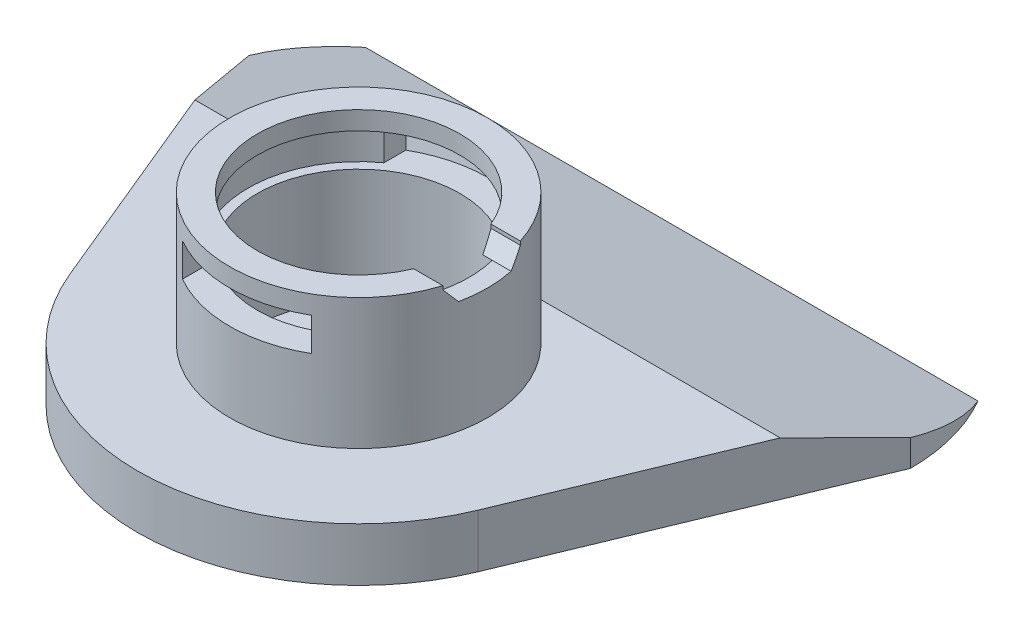
ISO-10303-21;
HEADER;
FILE_DESCRIPTION(('STEP AP214'),'2;1');
FILE_NAME('part.step','',(''),(''),'','','');
FILE_SCHEMA(('AUTOMOTIVE_DESIGN { 1 0 10303 214 1 1 1 1 }'));
ENDSEC;
DATA;
#1=APPLICATION_CONTEXT('core data for automotive mechanical design processes');
#2=APPLICATION_PROTOCOL_DEFINITION('international standard','automotive_design',2000,#1);
#3=PRODUCT_CONTEXT('',#1,'mechanical');
#4=PRODUCT('Part','Part','',(#3));
#5=PRODUCT_RELATED_PRODUCT_CATEGORY('part','',(#4));
#6=PRODUCT_DEFINITION_FORMATION('','',#4);
#7=PRODUCT_DEFINITION_CONTEXT('part definition',#1,'design');
#8=PRODUCT_DEFINITION('design','',#6,#7);
#9=PRODUCT_DEFINITION_SHAPE('','',#8);
#10=(LENGTH_UNIT() NAMED_UNIT(*) SI_UNIT(.MILLI.,.METRE.));
#11=(NAMED_UNIT(*) PLANE_ANGLE_UNIT() SI_UNIT($,.RADIAN.));
#12=(NAMED_UNIT(*) SI_UNIT($,.STERADIAN.) SOLID_ANGLE_UNIT());
#13=UNCERTAINTY_MEASURE_WITH_UNIT(LENGTH_MEASURE(1.E-05),#10,'distance_accuracy_value','');
#14=(GEOMETRIC_REPRESENTATION_CONTEXT(3) GLOBAL_UNCERTAINTY_ASSIGNED_CONTEXT((#13)) GLOBAL_UNIT_ASSIGNED_CONTEXT((#10,
#11,#12)) REPRESENTATION_CONTEXT('',''));
#15=CARTESIAN_POINT('',(0.,0.,0.));
#16=DIRECTION('',(0.,0.,1.));
#17=DIRECTION('',(1.,0.,0.));
#18=AXIS2_PLACEMENT_3D('',#15,#16,#17);
#19=CARTESIAN_POINT('',(0.,10.,0.));
#20=DIRECTION('',(0.,-1.,0.));
#21=DIRECTION('',(0.,0.,-1.));
#22=AXIS2_PLACEMENT_3D('',#19,#20,#21);
#23=CYLINDRICAL_SURFACE('',#22,7.);
#24=DIRECTION('',(0.,-1.,0.));
#25=VECTOR('',#24,1.);
#26=CARTESIAN_POINT('',(3.5,10.,6.06217782649107));
#27=LINE('',#26,#25);
#28=CARTESIAN_POINT('',(3.5,7.2,6.06217782649107));
#29=VERTEX_POINT('',#28);
#30=CARTESIAN_POINT('',(3.5,9.,6.06217782649107));
#31=VERTEX_POINT('',#30);
#32=EDGE_CURVE('E307',#29,#31,#27,.F.);
#33=ORIENTED_EDGE('',*,*,#32,.F.);
#34=CARTESIAN_POINT('',(0.,7.2,0.));
#35=DIRECTION('',(0.,1.,0.));
#36=DIRECTION('',(0.,0.,1.));
#37=AXIS2_PLACEMENT_3D('',#34,#35,#36);
#38=CIRCLE('',#37,7.);
#39=CARTESIAN_POINT('',(-3.5,7.2,6.06217782649107));
#40=VERTEX_POINT('',#39);
#41=EDGE_CURVE('E280',#40,#29,#38,.T.);
#42=ORIENTED_EDGE('',*,*,#41,.F.);
#43=DIRECTION('',(0.,-1.,0.));
#44=VECTOR('',#43,1.);
#45=CARTESIAN_POINT('',(-3.5,10.,6.06217782649107));
#46=LINE('',#45,#44);
#47=CARTESIAN_POINT('',(-3.5,9.,6.06217782649107));
#48=VERTEX_POINT('',#47);
#49=EDGE_CURVE('E292',#40,#48,#46,.F.);
#50=ORIENTED_EDGE('',*,*,#49,.T.);
#51=CARTESIAN_POINT('',(0.,9.,0.));
#52=DIRECTION('',(0.,-1.,0.));
#53=DIRECTION('',(0.,0.,-1.));
#54=AXIS2_PLACEMENT_3D('',#51,#52,#53);
#55=CIRCLE('',#54,7.);
#56=EDGE_CURVE('E316',#31,#48,#55,.T.);
#57=ORIENTED_EDGE('',*,*,#56,.F.);
#58=EDGE_LOOP('',(#33,#42,#50,#57));
#59=FACE_BOUND('',#58,.T.);
#60=CARTESIAN_POINT('',(0.,2.9,0.));
#61=DIRECTION('',(0.,1.,0.));
#62=DIRECTION('',(0.,0.,1.));
#63=AXIS2_PLACEMENT_3D('',#60,#61,#62);
#64=CIRCLE('',#63,7.);
#65=CARTESIAN_POINT('',(0.,2.9,-7.));
#66=VERTEX_POINT('',#65);
#67=EDGE_CURVE('E347',#66,#66,#64,.F.);
#68=ORIENTED_EDGE('',*,*,#67,.F.);
#69=EDGE_LOOP('',(#68));
#70=FACE_BOUND('',#69,.T.);
#71=DIRECTION('',(0.,-1.,0.));
#72=VECTOR('',#71,1.);
#73=CARTESIAN_POINT('',(3.5,10.,-6.06217782649107));
#74=LINE('',#73,#72);
#75=CARTESIAN_POINT('',(3.5,9.,-6.06217782649107));
#76=VERTEX_POINT('',#75);
#77=CARTESIAN_POINT('',(3.5,7.2,-6.06217782649107));
#78=VERTEX_POINT('',#77);
#79=EDGE_CURVE('E310',#76,#78,#74,.T.);
#80=ORIENTED_EDGE('',*,*,#79,.F.);
#81=CARTESIAN_POINT('',(-3.5,9.,-6.06217782649107));
#82=VERTEX_POINT('',#81);
#83=EDGE_CURVE('E313',#82,#76,#55,.T.);
#84=ORIENTED_EDGE('',*,*,#83,.F.);
#85=DIRECTION('',(0.,-1.,0.));
#86=VECTOR('',#85,1.);
#87=CARTESIAN_POINT('',(-3.5,10.,-6.06217782649107));
#88=LINE('',#87,#86);
#89=CARTESIAN_POINT('',(-3.5,7.2,-6.06217782649107));
#90=VERTEX_POINT('',#89);
#91=EDGE_CURVE('E296',#82,#90,#88,.T.);
#92=ORIENTED_EDGE('',*,*,#91,.T.);
#93=EDGE_CURVE('E283',#78,#90,#38,.T.);
#94=ORIENTED_EDGE('',*,*,#93,.F.);
#95=EDGE_LOOP('',(#80,#84,#92,#94));
#96=FACE_BOUND('',#95,.T.);
#97=DIRECTION('',(0.,-1.,0.));
#98=VECTOR('',#97,1.);
#99=CARTESIAN_POINT('',(6.67757440991862,10.,-2.1));
#100=LINE('',#99,#98);
#101=CARTESIAN_POINT('',(6.67757440991862,9.8,-2.1));
#102=VERTEX_POINT('',#101);
#103=CARTESIAN_POINT('',(6.67757440991862,10.,-2.1));
#104=VERTEX_POINT('',#103);
#105=EDGE_CURVE('E216',#102,#104,#100,.F.);
#106=ORIENTED_EDGE('',*,*,#105,.F.);
#107=CARTESIAN_POINT('',(0.,7.29731745555217,0.));
#108=DIRECTION('',(0.,0.642787609686541,0.766044443118977));
#109=DIRECTION('',(0.,-0.766044443118977,0.642787609686541));
#110=AXIS2_PLACEMENT_3D('',#107,#108,#109);
#111=ELLIPSE('',#110,10.8900667880229,7.);
#112=CARTESIAN_POINT('',(6.85264608151398,9.,-1.42872029505817));
#113=VERTEX_POINT('',#112);
#114=EDGE_CURVE('E202',#113,#102,#111,.T.);
#115=ORIENTED_EDGE('',*,*,#114,.F.);
#116=CARTESIAN_POINT('',(0.,9.,0.));
#117=DIRECTION('',(0.,1.,0.));
#118=DIRECTION('',(0.,0.,1.));
#119=AXIS2_PLACEMENT_3D('',#116,#117,#118);
#120=CIRCLE('',#119,7.);
#121=CARTESIAN_POINT('',(6.85264608151398,9.,1.42872029505817));
#122=VERTEX_POINT('',#121);
#123=EDGE_CURVE('E227',#122,#113,#120,.T.);
#124=ORIENTED_EDGE('',*,*,#123,.F.);
#125=CARTESIAN_POINT('',(0.,7.29731745555217,0.));
#126=DIRECTION('',(0.,0.642787609686541,-0.766044443118977));
#127=DIRECTION('',(0.,-0.766044443118977,-0.642787609686541));
#128=AXIS2_PLACEMENT_3D('',#125,#126,#127);
#129=ELLIPSE('',#128,10.8900667880229,7.);
#130=CARTESIAN_POINT('',(6.67757440991862,9.8,2.1));
#131=VERTEX_POINT('',#130);
#132=EDGE_CURVE('E433',#131,#122,#129,.T.);
#133=ORIENTED_EDGE('',*,*,#132,.F.);
#134=DIRECTION('',(0.,-1.,0.));
#135=VECTOR('',#134,1.);
#136=CARTESIAN_POINT('',(6.67757440991862,10.,2.1));
#137=LINE('',#136,#135);
#138=CARTESIAN_POINT('',(6.67757440991862,10.,2.1));
#139=VERTEX_POINT('',#138);
#140=EDGE_CURVE('E234',#139,#131,#137,.T.);
#141=ORIENTED_EDGE('',*,*,#140,.F.);
#142=CARTESIAN_POINT('',(0.,10.,0.));
#143=DIRECTION('',(0.,1.,0.));
#144=DIRECTION('',(0.,0.,1.));
#145=AXIS2_PLACEMENT_3D('',#142,#143,#144);
#146=CIRCLE('',#145,7.);
#147=EDGE_CURVE('E225',#104,#139,#146,.T.);
#148=ORIENTED_EDGE('',*,*,#147,.F.);
#149=EDGE_LOOP('',(#106,#115,#124,#133,#141,#148));
#150=FACE_BOUND('',#149,.T.);
#151=ADVANCED_FACE('F44',(#59,#70,#96,#150),#23,.T.);
#152=CARTESIAN_POINT('',(0.,10.,0.));
#153=DIRECTION('',(0.,1.,0.));
#154=DIRECTION('',(0.,0.,1.));
#155=AXIS2_PLACEMENT_3D('',#152,#153,#154);
#156=PLANE('',#155);
#157=CARTESIAN_POINT('',(0.,10.,0.));
#158=DIRECTION('',(0.,1.,0.));
#159=DIRECTION('',(0.,0.,1.));
#160=AXIS2_PLACEMENT_3D('',#157,#158,#159);
#161=CIRCLE('',#160,5.5);
#162=CARTESIAN_POINT('',(5.08330601085553,10.,-2.1));
#163=VERTEX_POINT('',#162);
#164=CARTESIAN_POINT('',(5.08330601085553,10.,2.1));
#165=VERTEX_POINT('',#164);
#166=EDGE_CURVE('E330',#163,#165,#161,.T.);
#167=ORIENTED_EDGE('',*,*,#166,.F.);
#168=DIRECTION('',(1.,0.,0.));
#169=VECTOR('',#168,1.);
#170=CARTESIAN_POINT('',(0.,10.,-2.1));
#171=LINE('',#170,#169);
#172=EDGE_CURVE('E228',#163,#104,#171,.T.);
#173=ORIENTED_EDGE('',*,*,#172,.T.);
#174=ORIENTED_EDGE('',*,*,#147,.T.);
#175=DIRECTION('',(-1.,0.,0.));
#176=VECTOR('',#175,1.);
#177=CARTESIAN_POINT('',(0.,10.,2.1));
#178=LINE('',#177,#176);
#179=EDGE_CURVE('E425',#139,#165,#178,.T.);
#180=ORIENTED_EDGE('',*,*,#179,.T.);
#181=EDGE_LOOP('',(#167,#173,#174,#180));
#182=FACE_BOUND('',#181,.T.);
#183=ADVANCED_FACE('F431',(#182),#156,.T.);
#184=CARTESIAN_POINT('',(0.,1.,0.));
#185=DIRECTION('',(0.,1.,0.));
#186=DIRECTION('',(0.,0.,1.));
#187=AXIS2_PLACEMENT_3D('',#184,#185,#186);
#188=CYLINDRICAL_SURFACE('',#187,5.5);
#189=CARTESIAN_POINT('',(0.,7.29731745555217,0.));
#190=DIRECTION('',(0.,0.642787609686541,0.766044443118977));
#191=DIRECTION('',(0.,0.766044443118977,-0.642787609686541));
#192=AXIS2_PLACEMENT_3D('',#189,#190,#191);
#193=ELLIPSE('',#192,8.55648104773225,5.5);
#194=CARTESIAN_POINT('',(5.08330601085553,9.8,-2.1));
#195=VERTEX_POINT('',#194);
#196=CARTESIAN_POINT('',(5.31119179831503,9.,-1.42872029505817));
#197=VERTEX_POINT('',#196);
#198=EDGE_CURVE('E60',#195,#197,#193,.F.);
#199=ORIENTED_EDGE('',*,*,#198,.F.);
#200=DIRECTION('',(0.,1.,0.));
#201=VECTOR('',#200,1.);
#202=CARTESIAN_POINT('',(5.08330601085553,1.,-2.1));
#203=LINE('',#202,#201);
#204=EDGE_CURVE('E11',#163,#195,#203,.F.);
#205=ORIENTED_EDGE('',*,*,#204,.F.);
#206=ORIENTED_EDGE('',*,*,#166,.T.);
#207=DIRECTION('',(0.,1.,0.));
#208=VECTOR('',#207,1.);
#209=CARTESIAN_POINT('',(5.08330601085553,1.,2.1));
#210=LINE('',#209,#208);
#211=CARTESIAN_POINT('',(5.08330601085553,9.8,2.1));
#212=VERTEX_POINT('',#211);
#213=EDGE_CURVE('E53',#212,#165,#210,.T.);
#214=ORIENTED_EDGE('',*,*,#213,.F.);
#215=CARTESIAN_POINT('',(0.,7.29731745555217,0.));
#216=DIRECTION('',(0.,0.642787609686541,-0.766044443118977));
#217=DIRECTION('',(0.,0.766044443118977,0.642787609686541));
#218=AXIS2_PLACEMENT_3D('',#215,#216,#217);
#219=ELLIPSE('',#218,8.55648104773225,5.5);
#220=CARTESIAN_POINT('',(5.31119179831503,9.,1.42872029505817));
#221=VERTEX_POINT('',#220);
#222=EDGE_CURVE('E212',#221,#212,#219,.F.);
#223=ORIENTED_EDGE('',*,*,#222,.F.);
#224=CARTESIAN_POINT('',(0.,9.,0.));
#225=DIRECTION('',(0.,1.,0.));
#226=DIRECTION('',(0.,0.,1.));
#227=AXIS2_PLACEMENT_3D('',#224,#225,#226);
#228=CIRCLE('',#227,5.5);
#229=EDGE_CURVE('E322',#197,#221,#228,.T.);
#230=ORIENTED_EDGE('',*,*,#229,.F.);
#231=EDGE_LOOP('',(#199,#205,#206,#214,#223,#230));
#232=FACE_BOUND('',#231,.T.);
#233=ADVANCED_FACE('F435',(#232),#188,.F.);
#234=CARTESIAN_POINT('',(0.,9.,0.));
#235=DIRECTION('',(0.,1.,0.));
#236=DIRECTION('',(0.,0.,1.));
#237=AXIS2_PLACEMENT_3D('',#234,#235,#236);
#238=PLANE('',#237);
#239=DIRECTION('',(-1.,0.,0.));
#240=VECTOR('',#239,1.);
#241=CARTESIAN_POINT('',(0.,9.,1.42872029505817));
#242=LINE('',#241,#240);
#243=CARTESIAN_POINT('',(5.82741437676169,9.,1.42872029505817));
#244=VERTEX_POINT('',#243);
#245=EDGE_CURVE('E417',#244,#221,#242,.T.);
#246=ORIENTED_EDGE('',*,*,#245,.F.);
#247=CARTESIAN_POINT('',(0.,9.,0.));
#248=DIRECTION('',(0.,1.,0.));
#249=DIRECTION('',(0.,0.,1.));
#250=AXIS2_PLACEMENT_3D('',#247,#248,#249);
#251=CIRCLE('',#250,6.);
#252=CARTESIAN_POINT('',(3.5,9.,4.87339717240448));
#253=VERTEX_POINT('',#252);
#254=EDGE_CURVE('E332',#253,#244,#251,.T.);
#255=ORIENTED_EDGE('',*,*,#254,.F.);
#256=DIRECTION('',(0.,0.,1.));
#257=VECTOR('',#256,1.);
#258=CARTESIAN_POINT('',(3.5,9.,-17.));
#259=LINE('',#258,#257);
#260=EDGE_CURVE('E68',#253,#31,#259,.T.);
#261=ORIENTED_EDGE('',*,*,#260,.T.);
#262=ORIENTED_EDGE('',*,*,#56,.T.);
#263=DIRECTION('',(0.,0.,1.));
#264=VECTOR('',#263,1.);
#265=CARTESIAN_POINT('',(-3.5,9.,-17.));
#266=LINE('',#265,#264);
#267=CARTESIAN_POINT('',(-3.5,9.,4.87339717240448));
#268=VERTEX_POINT('',#267);
#269=EDGE_CURVE('E273',#268,#48,#266,.T.);
#270=ORIENTED_EDGE('',*,*,#269,.F.);
#271=CARTESIAN_POINT('',(-3.5,9.,-4.87339717240448));
#272=VERTEX_POINT('',#271);
#273=EDGE_CURVE('E321',#272,#268,#251,.T.);
#274=ORIENTED_EDGE('',*,*,#273,.F.);
#275=EDGE_CURVE('E272',#82,#272,#266,.T.);
#276=ORIENTED_EDGE('',*,*,#275,.F.);
#277=ORIENTED_EDGE('',*,*,#83,.T.);
#278=CARTESIAN_POINT('',(3.5,9.,-4.87339717240448));
#279=VERTEX_POINT('',#278);
#280=EDGE_CURVE('E277',#76,#279,#259,.T.);
#281=ORIENTED_EDGE('',*,*,#280,.T.);
#282=CARTESIAN_POINT('',(5.82741437676169,9.,-1.42872029505817));
#283=VERTEX_POINT('',#282);
#284=EDGE_CURVE('E337',#283,#279,#251,.T.);
#285=ORIENTED_EDGE('',*,*,#284,.F.);
#286=DIRECTION('',(1.,0.,0.));
#287=VECTOR('',#286,1.);
#288=CARTESIAN_POINT('',(0.,9.,-1.42872029505817));
#289=LINE('',#288,#287);
#290=EDGE_CURVE('E414',#197,#283,#289,.T.);
#291=ORIENTED_EDGE('',*,*,#290,.F.);
#292=ORIENTED_EDGE('',*,*,#229,.T.);
#293=EDGE_LOOP('',(#246,#255,#261,#262,#270,#274,#276,#277,#281,#285,#291,#292));
#294=FACE_BOUND('',#293,.T.);
#295=ADVANCED_FACE('F460',(#294),#238,.F.);
#296=CARTESIAN_POINT('',(0.,7.2,0.));
#297=DIRECTION('',(0.,1.,0.));
#298=DIRECTION('',(0.,0.,1.));
#299=AXIS2_PLACEMENT_3D('',#296,#297,#298);
#300=CYLINDRICAL_SURFACE('',#299,6.);
#301=DIRECTION('',(0.,1.,0.));
#302=VECTOR('',#301,1.);
#303=CARTESIAN_POINT('',(3.5,7.2,4.87339717240448));
#304=LINE('',#303,#302);
#305=CARTESIAN_POINT('',(3.5,7.2,4.87339717240448));
#306=VERTEX_POINT('',#305);
#307=EDGE_CURVE('E304',#253,#306,#304,.F.);
#308=ORIENTED_EDGE('',*,*,#307,.F.);
#309=ORIENTED_EDGE('',*,*,#254,.T.);
#310=EDGE_CURVE('E336',#244,#283,#251,.T.);
#311=ORIENTED_EDGE('',*,*,#310,.T.);
#312=ORIENTED_EDGE('',*,*,#284,.T.);
#313=DIRECTION('',(0.,1.,0.));
#314=VECTOR('',#313,1.);
#315=CARTESIAN_POINT('',(3.5,7.2,-4.87339717240448));
#316=LINE('',#315,#314);
#317=CARTESIAN_POINT('',(3.5,7.2,-4.87339717240448));
#318=VERTEX_POINT('',#317);
#319=EDGE_CURVE('E300',#318,#279,#316,.T.);
#320=ORIENTED_EDGE('',*,*,#319,.F.);
#321=CARTESIAN_POINT('',(0.,7.2,0.));
#322=DIRECTION('',(0.,1.,0.));
#323=DIRECTION('',(0.,0.,1.));
#324=AXIS2_PLACEMENT_3D('',#321,#322,#323);
#325=CIRCLE('',#324,6.);
#326=EDGE_CURVE('E326',#306,#318,#325,.T.);
#327=ORIENTED_EDGE('',*,*,#326,.F.);
#328=EDGE_LOOP('',(#308,#309,#311,#312,#320,#327));
#329=FACE_BOUND('',#328,.T.);
#330=ADVANCED_FACE('F463',(#329),#300,.F.);
#331=CARTESIAN_POINT('',(0.,2.9,0.));
#332=DIRECTION('',(0.,-1.,0.));
#333=DIRECTION('',(0.,0.,-1.));
#334=AXIS2_PLACEMENT_3D('',#331,#332,#333);
#335=CYLINDRICAL_SURFACE('',#334,12.);
#336=CARTESIAN_POINT('',(0.,0.,0.));
#337=DIRECTION('',(0.,1.,0.));
#338=DIRECTION('',(0.,0.,1.));
#339=AXIS2_PLACEMENT_3D('',#336,#337,#338);
#340=CIRCLE('',#339,12.);
#341=CARTESIAN_POINT('',(-11.0865543901354,0.,4.59220118838109));
#342=VERTEX_POINT('',#341);
#343=CARTESIAN_POINT('',(11.0865543901354,0.,4.59220118838109));
#344=VERTEX_POINT('',#343);
#345=EDGE_CURVE('E351',#342,#344,#340,.T.);
#346=ORIENTED_EDGE('',*,*,#345,.T.);
#347=DIRECTION('',(0.,-1.,0.));
#348=VECTOR('',#347,1.);
#349=CARTESIAN_POINT('',(11.0865543901354,2.9,4.59220118838109));
#350=LINE('',#349,#348);
#351=CARTESIAN_POINT('',(11.0865543901354,2.9,4.59220118838109));
#352=VERTEX_POINT('',#351);
#353=EDGE_CURVE('E410',#352,#344,#350,.T.);
#354=ORIENTED_EDGE('',*,*,#353,.F.);
#355=CARTESIAN_POINT('',(0.,2.9,0.));
#356=DIRECTION('',(0.,1.,0.));
#357=DIRECTION('',(0.,0.,1.));
#358=AXIS2_PLACEMENT_3D('',#355,#356,#357);
#359=CIRCLE('',#358,12.);
#360=CARTESIAN_POINT('',(-11.0865543901354,2.9,4.59220118838109));
#361=VERTEX_POINT('',#360);
#362=EDGE_CURVE('E352',#361,#352,#359,.T.);
#363=ORIENTED_EDGE('',*,*,#362,.F.);
#364=DIRECTION('',(0.,-1.,0.));
#365=VECTOR('',#364,1.);
#366=CARTESIAN_POINT('',(-11.0865543901354,2.9,4.59220118838109));
#367=LINE('',#366,#365);
#368=EDGE_CURVE('E365',#361,#342,#367,.T.);
#369=ORIENTED_EDGE('',*,*,#368,.T.);
#370=EDGE_LOOP('',(#346,#354,#363,#369));
#371=FACE_BOUND('',#370,.T.);
#372=ADVANCED_FACE('F46',(#371),#335,.T.);
#373=CARTESIAN_POINT('',(11.0865543901354,2.9,4.59220118838109));
#374=DIRECTION('',(-0.923879532511286,0.,-0.382683432365091));
#375=DIRECTION('',(-0.382683432365091,0.,0.923879532511287));
#376=AXIS2_PLACEMENT_3D('',#373,#374,#375);
#377=PLANE('',#376);
#378=DIRECTION('',(0.,-1.,0.));
#379=VECTOR('',#378,1.);
#380=CARTESIAN_POINT('',(17.9592691519859,2.9,-12.));
#381=LINE('',#380,#379);
#382=CARTESIAN_POINT('',(17.9592691519859,1.45,-12.));
#383=VERTEX_POINT('',#382);
#384=CARTESIAN_POINT('',(17.9592691519859,0.,-12.));
#385=VERTEX_POINT('',#384);
#386=EDGE_CURVE('E407',#383,#385,#381,.T.);
#387=ORIENTED_EDGE('',*,*,#386,.F.);
#388=DIRECTION('',(-0.3696460402259,0.258797300241354,0.892404483590876));
#389=VECTOR('',#388,1.);
#390=CARTESIAN_POINT('',(11.4081497008664,6.03658241400943,3.81580142761872));
#391=LINE('',#390,#389);
#392=CARTESIAN_POINT('',(15.8882013401204,2.9,-7.));
#393=VERTEX_POINT('',#392);
#394=EDGE_CURVE('E258',#383,#393,#391,.T.);
#395=ORIENTED_EDGE('',*,*,#394,.T.);
#396=DIRECTION('',(0.382683432365091,0.,-0.923879532511287));
#397=VECTOR('',#396,1.);
#398=CARTESIAN_POINT('',(11.0865543901354,2.9,4.59220118838109));
#399=LINE('',#398,#397);
#400=EDGE_CURVE('E356',#352,#393,#399,.T.);
#401=ORIENTED_EDGE('',*,*,#400,.F.);
#402=ORIENTED_EDGE('',*,*,#353,.T.);
#403=DIRECTION('',(0.382683432365091,0.,-0.923879532511287));
#404=VECTOR('',#403,1.);
#405=CARTESIAN_POINT('',(11.0865543901354,0.,4.59220118838109));
#406=LINE('',#405,#404);
#407=EDGE_CURVE('E369',#344,#385,#406,.T.);
#408=ORIENTED_EDGE('',*,*,#407,.T.);
#409=EDGE_LOOP('',(#387,#395,#401,#402,#408));
#410=FACE_BOUND('',#409,.T.);
#411=ADVANCED_FACE('F500',(#410),#377,.F.);
#412=CARTESIAN_POINT('',(17.9592691519859,2.9,0.));
#413=DIRECTION('',(-1.,0.,0.));
#414=DIRECTION('',(0.,0.,1.));
#415=AXIS2_PLACEMENT_3D('',#412,#413,#414);
#416=PLANE('',#415);
#417=DIRECTION('',(0.,-1.,0.));
#418=VECTOR('',#417,1.);
#419=CARTESIAN_POINT('',(17.9592691519859,2.9,-12.01));
#420=LINE('',#419,#418);
#421=CARTESIAN_POINT('',(17.9592691519859,1.4471,-12.01));
#422=VERTEX_POINT('',#421);
#423=CARTESIAN_POINT('',(17.9592691519859,0.,-12.01));
#424=VERTEX_POINT('',#423);
#425=EDGE_CURVE('E404',#422,#424,#420,.T.);
#426=ORIENTED_EDGE('',*,*,#425,.F.);
#427=DIRECTION('',(0.,-0.278524450245832,-0.960429138778732));
#428=VECTOR('',#427,1.);
#429=CARTESIAN_POINT('',(17.9592691519859,0.,-17.));
#430=LINE('',#429,#428);
#431=EDGE_CURVE('E232',#383,#422,#430,.T.);
#432=ORIENTED_EDGE('',*,*,#431,.F.);
#433=ORIENTED_EDGE('',*,*,#386,.T.);
#434=DIRECTION('',(0.,0.,-1.));
#435=VECTOR('',#434,1.);
#436=CARTESIAN_POINT('',(17.9592691519859,0.,0.));
#437=LINE('',#436,#435);
#438=EDGE_CURVE('E373',#385,#424,#437,.T.);
#439=ORIENTED_EDGE('',*,*,#438,.T.);
#440=EDGE_LOOP('',(#426,#432,#433,#439));
#441=FACE_BOUND('',#440,.T.);
#442=ADVANCED_FACE('F504',(#441),#416,.F.);
#443=CARTESIAN_POINT('',(7.96926915198588,2.9,-12.01));
#444=DIRECTION('',(0.,-1.,0.));
#445=DIRECTION('',(0.,0.,-1.));
#446=AXIS2_PLACEMENT_3D('',#443,#444,#445);
#447=CYLINDRICAL_SURFACE('',#446,9.99);
#448=CARTESIAN_POINT('',(7.96926915198588,0.,-12.01));
#449=DIRECTION('',(0.,1.,0.));
#450=DIRECTION('',(0.,0.,1.));
#451=AXIS2_PLACEMENT_3D('',#448,#449,#450);
#452=CIRCLE('',#451,9.99);
#453=CARTESIAN_POINT('',(16.6237477613534,0.,-17.));
#454=VERTEX_POINT('',#453);
#455=EDGE_CURVE('E377',#424,#454,#452,.T.);
#456=ORIENTED_EDGE('',*,*,#455,.T.);
#457=CARTESIAN_POINT('',(7.96926915198588,1.4471,-12.01));
#458=DIRECTION('',(0.,-0.960429138778732,0.278524450245832));
#459=DIRECTION('',(0.,-0.278524450245832,-0.960429138778732));
#460=AXIS2_PLACEMENT_3D('',#457,#458,#459);
#461=ELLIPSE('',#460,10.4016002812067,9.99);
#462=EDGE_CURVE('E254',#454,#422,#461,.T.);
#463=ORIENTED_EDGE('',*,*,#462,.T.);
#464=ORIENTED_EDGE('',*,*,#425,.T.);
#465=EDGE_LOOP('',(#456,#463,#464));
#466=FACE_BOUND('',#465,.T.);
#467=ADVANCED_FACE('F508',(#466),#447,.T.);
#468=CARTESIAN_POINT('',(-7.96926915198588,2.9,-12.01));
#469=DIRECTION('',(0.,-1.,0.));
#470=DIRECTION('',(0.,0.,-1.));
#471=AXIS2_PLACEMENT_3D('',#468,#469,#470);
#472=CYLINDRICAL_SURFACE('',#471,9.99);
#473=CARTESIAN_POINT('',(-7.96926915198588,1.4471,-12.01));
#474=DIRECTION('',(0.,-0.960429138778732,0.278524450245832));
#475=DIRECTION('',(0.,-0.278524450245832,-0.960429138778732));
#476=AXIS2_PLACEMENT_3D('',#473,#474,#475);
#477=ELLIPSE('',#476,10.4016002812067,9.99);
#478=CARTESIAN_POINT('',(-16.6237477613534,0.,-17.));
#479=VERTEX_POINT('',#478);
#480=CARTESIAN_POINT('',(-17.9592691519859,1.4471,-12.01));
#481=VERTEX_POINT('',#480);
#482=EDGE_CURVE('E251',#479,#481,#477,.F.);
#483=ORIENTED_EDGE('',*,*,#482,.F.);
#484=CARTESIAN_POINT('',(-7.96926915198588,0.,-12.01));
#485=DIRECTION('',(0.,1.,0.));
#486=DIRECTION('',(0.,0.,1.));
#487=AXIS2_PLACEMENT_3D('',#484,#485,#486);
#488=CIRCLE('',#487,9.99);
#489=CARTESIAN_POINT('',(-17.9592691519859,0.,-12.01));
#490=VERTEX_POINT('',#489);
#491=EDGE_CURVE('E385',#490,#479,#488,.F.);
#492=ORIENTED_EDGE('',*,*,#491,.F.);
#493=DIRECTION('',(0.,-1.,0.));
#494=VECTOR('',#493,1.);
#495=CARTESIAN_POINT('',(-17.9592691519859,2.9,-12.01));
#496=LINE('',#495,#494);
#497=EDGE_CURVE('E401',#481,#490,#496,.T.);
#498=ORIENTED_EDGE('',*,*,#497,.F.);
#499=EDGE_LOOP('',(#483,#492,#498));
#500=FACE_BOUND('',#499,.T.);
#501=ADVANCED_FACE('F514',(#500),#472,.T.);
#502=CARTESIAN_POINT('',(-17.9592691519859,2.9,0.));
#503=DIRECTION('',(-1.,0.,0.));
#504=DIRECTION('',(0.,0.,1.));
#505=AXIS2_PLACEMENT_3D('',#502,#503,#504);
#506=PLANE('',#505);
#507=DIRECTION('',(0.,-0.278524450245832,-0.960429138778732));
#508=VECTOR('',#507,1.);
#509=CARTESIAN_POINT('',(-17.9592691519859,0.,-17.));
#510=LINE('',#509,#508);
#511=CARTESIAN_POINT('',(-17.9592691519859,1.45,-12.));
#512=VERTEX_POINT('',#511);
#513=EDGE_CURVE('E240',#512,#481,#510,.T.);
#514=ORIENTED_EDGE('',*,*,#513,.T.);
#515=ORIENTED_EDGE('',*,*,#497,.T.);
#516=DIRECTION('',(0.,0.,-1.));
#517=VECTOR('',#516,1.);
#518=CARTESIAN_POINT('',(-17.9592691519859,0.,0.));
#519=LINE('',#518,#517);
#520=CARTESIAN_POINT('',(-17.9592691519859,0.,-12.));
#521=VERTEX_POINT('',#520);
#522=EDGE_CURVE('E389',#521,#490,#519,.T.);
#523=ORIENTED_EDGE('',*,*,#522,.F.);
#524=DIRECTION('',(0.,-1.,0.));
#525=VECTOR('',#524,1.);
#526=CARTESIAN_POINT('',(-17.9592691519859,2.9,-12.));
#527=LINE('',#526,#525);
#528=EDGE_CURVE('E398',#512,#521,#527,.T.);
#529=ORIENTED_EDGE('',*,*,#528,.F.);
#530=EDGE_LOOP('',(#514,#515,#523,#529));
#531=FACE_BOUND('',#530,.T.);
#532=ADVANCED_FACE('F521',(#531),#506,.T.);
#533=CARTESIAN_POINT('',(-11.0865543901354,2.9,4.59220118838109));
#534=DIRECTION('',(-0.923879532511287,0.,0.382683432365091));
#535=DIRECTION('',(0.382683432365091,0.,0.923879532511287));
#536=AXIS2_PLACEMENT_3D('',#533,#534,#535);
#537=PLANE('',#536);
#538=DIRECTION('',(0.3696460402259,0.258797300241354,0.892404483590876));
#539=VECTOR('',#538,1.);
#540=CARTESIAN_POINT('',(-11.4081497008664,6.03658241400943,3.81580142761872));
#541=LINE('',#540,#539);
#542=CARTESIAN_POINT('',(-15.8882013401204,2.9,-7.));
#543=VERTEX_POINT('',#542);
#544=EDGE_CURVE('E248',#512,#543,#541,.T.);
#545=ORIENTED_EDGE('',*,*,#544,.F.);
#546=ORIENTED_EDGE('',*,*,#528,.T.);
#547=DIRECTION('',(-0.382683432365091,0.,-0.923879532511287));
#548=VECTOR('',#547,1.);
#549=CARTESIAN_POINT('',(-11.0865543901354,0.,4.59220118838109));
#550=LINE('',#549,#548);
#551=EDGE_CURVE('E357',#342,#521,#550,.T.);
#552=ORIENTED_EDGE('',*,*,#551,.F.);
#553=ORIENTED_EDGE('',*,*,#368,.F.);
#554=DIRECTION('',(-0.382683432365091,0.,-0.923879532511287));
#555=VECTOR('',#554,1.);
#556=CARTESIAN_POINT('',(-11.0865543901354,2.9,4.59220118838109));
#557=LINE('',#556,#555);
#558=EDGE_CURVE('E361',#361,#543,#557,.T.);
#559=ORIENTED_EDGE('',*,*,#558,.T.);
#560=EDGE_LOOP('',(#545,#546,#552,#553,#559));
#561=FACE_BOUND('',#560,.T.);
#562=ADVANCED_FACE('F523',(#561),#537,.T.);
#563=CARTESIAN_POINT('',(0.,2.9,0.));
#564=DIRECTION('',(0.,1.,0.));
#565=DIRECTION('',(0.,0.,1.));
#566=AXIS2_PLACEMENT_3D('',#563,#564,#565);
#567=PLANE('',#566);
#568=DIRECTION('',(1.,0.,0.));
#569=VECTOR('',#568,1.);
#570=CARTESIAN_POINT('',(-17.9592691519859,2.9,-7.));
#571=LINE('',#570,#569);
#572=EDGE_CURVE('E247',#543,#66,#571,.T.);
#573=ORIENTED_EDGE('',*,*,#572,.F.);
#574=ORIENTED_EDGE('',*,*,#558,.F.);
#575=ORIENTED_EDGE('',*,*,#362,.T.);
#576=ORIENTED_EDGE('',*,*,#400,.T.);
#577=EDGE_CURVE('E244',#66,#393,#571,.T.);
#578=ORIENTED_EDGE('',*,*,#577,.F.);
#579=ORIENTED_EDGE('',*,*,#67,.T.);
#580=EDGE_LOOP('',(#573,#574,#575,#576,#578,#579));
#581=FACE_BOUND('',#580,.T.);
#582=ADVANCED_FACE('F494',(#581),#567,.T.);
#583=CARTESIAN_POINT('',(0.,0.,0.));
#584=DIRECTION('',(0.,1.,0.));
#585=DIRECTION('',(0.,0.,1.));
#586=AXIS2_PLACEMENT_3D('',#583,#584,#585);
#587=PLANE('',#586);
#588=ORIENTED_EDGE('',*,*,#345,.F.);
#589=ORIENTED_EDGE('',*,*,#551,.T.);
#590=ORIENTED_EDGE('',*,*,#522,.T.);
#591=ORIENTED_EDGE('',*,*,#491,.T.);
#592=DIRECTION('',(1.,0.,0.));
#593=VECTOR('',#592,1.);
#594=CARTESIAN_POINT('',(0.,0.,-17.));
#595=LINE('',#594,#593);
#596=EDGE_CURVE('E381',#479,#454,#595,.T.);
#597=ORIENTED_EDGE('',*,*,#596,.T.);
#598=ORIENTED_EDGE('',*,*,#455,.F.);
#599=ORIENTED_EDGE('',*,*,#438,.F.);
#600=ORIENTED_EDGE('',*,*,#407,.F.);
#601=EDGE_LOOP('',(#588,#589,#590,#591,#597,#598,#599,#600));
#602=FACE_BOUND('',#601,.T.);
#603=ADVANCED_FACE('F516',(#602),#587,.F.);
#604=ORIENTED_EDGE('',*,*,#273,.T.);
#605=DIRECTION('',(0.,1.,0.));
#606=VECTOR('',#605,1.);
#607=CARTESIAN_POINT('',(-3.5,7.2,4.87339717240448));
#608=LINE('',#607,#606);
#609=CARTESIAN_POINT('',(-3.5,7.2,4.87339717240448));
#610=VERTEX_POINT('',#609);
#611=EDGE_CURVE('E288',#268,#610,#608,.F.);
#612=ORIENTED_EDGE('',*,*,#611,.T.);
#613=CARTESIAN_POINT('',(-3.5,7.2,-4.87339717240448));
#614=VERTEX_POINT('',#613);
#615=EDGE_CURVE('E331',#614,#610,#325,.T.);
#616=ORIENTED_EDGE('',*,*,#615,.F.);
#617=DIRECTION('',(0.,1.,0.));
#618=VECTOR('',#617,1.);
#619=CARTESIAN_POINT('',(-3.5,7.2,-4.87339717240448));
#620=LINE('',#619,#618);
#621=EDGE_CURVE('E284',#614,#272,#620,.T.);
#622=ORIENTED_EDGE('',*,*,#621,.T.);
#623=EDGE_LOOP('',(#604,#612,#616,#622));
#624=FACE_BOUND('',#623,.T.);
#625=ADVANCED_FACE('F533',(#624),#300,.F.);
#626=CARTESIAN_POINT('',(0.,7.2,0.));
#627=DIRECTION('',(0.,1.,0.));
#628=DIRECTION('',(0.,0.,1.));
#629=AXIS2_PLACEMENT_3D('',#626,#627,#628);
#630=PLANE('',#629);
#631=CARTESIAN_POINT('',(0.,7.2,0.));
#632=DIRECTION('',(0.,1.,0.));
#633=DIRECTION('',(0.,0.,1.));
#634=AXIS2_PLACEMENT_3D('',#631,#632,#633);
#635=CIRCLE('',#634,5.5);
#636=CARTESIAN_POINT('',(0.,7.2,5.5));
#637=VERTEX_POINT('',#636);
#638=EDGE_CURVE('E317',#637,#637,#635,.T.);
#639=ORIENTED_EDGE('',*,*,#638,.F.);
#640=EDGE_LOOP('',(#639));
#641=FACE_BOUND('',#640,.T.);
#642=ORIENTED_EDGE('',*,*,#326,.T.);
#643=DIRECTION('',(0.,0.,1.));
#644=VECTOR('',#643,1.);
#645=CARTESIAN_POINT('',(3.5,7.2,-17.));
#646=LINE('',#645,#644);
#647=EDGE_CURVE('E266',#78,#318,#646,.T.);
#648=ORIENTED_EDGE('',*,*,#647,.F.);
#649=ORIENTED_EDGE('',*,*,#93,.T.);
#650=DIRECTION('',(0.,0.,1.));
#651=VECTOR('',#650,1.);
#652=CARTESIAN_POINT('',(-3.5,7.2,-17.));
#653=LINE('',#652,#651);
#654=EDGE_CURVE('E267',#90,#614,#653,.T.);
#655=ORIENTED_EDGE('',*,*,#654,.T.);
#656=ORIENTED_EDGE('',*,*,#615,.T.);
#657=EDGE_CURVE('E268',#610,#40,#653,.T.);
#658=ORIENTED_EDGE('',*,*,#657,.T.);
#659=ORIENTED_EDGE('',*,*,#41,.T.);
#660=EDGE_CURVE('E262',#306,#29,#646,.T.);
#661=ORIENTED_EDGE('',*,*,#660,.F.);
#662=EDGE_LOOP('',(#642,#648,#649,#655,#656,#658,#659,#661));
#663=FACE_BOUND('',#662,.T.);
#664=ADVANCED_FACE('F471',(#641,#663),#630,.T.);
#665=CARTESIAN_POINT('',(0.,1.,0.));
#666=DIRECTION('',(0.,1.,0.));
#667=DIRECTION('',(0.,0.,1.));
#668=AXIS2_PLACEMENT_3D('',#665,#666,#667);
#669=PLANE('',#668);
#670=CARTESIAN_POINT('',(0.,1.,0.));
#671=DIRECTION('',(0.,1.,0.));
#672=DIRECTION('',(0.,0.,1.));
#673=AXIS2_PLACEMENT_3D('',#670,#671,#672);
#674=CIRCLE('',#673,5.5);
#675=CARTESIAN_POINT('',(0.,1.,5.5));
#676=VERTEX_POINT('',#675);
#677=EDGE_CURVE('E338',#676,#676,#674,.T.);
#678=ORIENTED_EDGE('',*,*,#677,.T.);
#679=EDGE_LOOP('',(#678));
#680=FACE_BOUND('',#679,.T.);
#681=ADVANCED_FACE('F731',(#680),#669,.T.);
#682=ORIENTED_EDGE('',*,*,#677,.F.);
#683=EDGE_LOOP('',(#682));
#684=FACE_BOUND('',#683,.T.);
#685=ORIENTED_EDGE('',*,*,#638,.T.);
#686=EDGE_LOOP('',(#685));
#687=FACE_BOUND('',#686,.T.);
#688=ADVANCED_FACE('F613',(#684,#687),#188,.F.);
#689=CARTESIAN_POINT('',(-3.5,0.,-17.));
#690=DIRECTION('',(-1.,0.,0.));
#691=DIRECTION('',(0.,0.,1.));
#692=AXIS2_PLACEMENT_3D('',#689,#690,#691);
#693=PLANE('',#692);
#694=ORIENTED_EDGE('',*,*,#275,.T.);
#695=ORIENTED_EDGE('',*,*,#621,.F.);
#696=ORIENTED_EDGE('',*,*,#654,.F.);
#697=ORIENTED_EDGE('',*,*,#91,.F.);
#698=EDGE_LOOP('',(#694,#695,#696,#697));
#699=FACE_BOUND('',#698,.T.);
#700=ADVANCED_FACE('F693',(#699),#693,.F.);
#701=CARTESIAN_POINT('',(3.5,0.,-17.));
#702=DIRECTION('',(-1.,0.,0.));
#703=DIRECTION('',(0.,0.,1.));
#704=AXIS2_PLACEMENT_3D('',#701,#702,#703);
#705=PLANE('',#704);
#706=ORIENTED_EDGE('',*,*,#79,.T.);
#707=ORIENTED_EDGE('',*,*,#647,.T.);
#708=ORIENTED_EDGE('',*,*,#319,.T.);
#709=ORIENTED_EDGE('',*,*,#280,.F.);
#710=EDGE_LOOP('',(#706,#707,#708,#709));
#711=FACE_BOUND('',#710,.T.);
#712=ADVANCED_FACE('F699',(#711),#705,.T.);
#713=ORIENTED_EDGE('',*,*,#32,.T.);
#714=ORIENTED_EDGE('',*,*,#260,.F.);
#715=ORIENTED_EDGE('',*,*,#307,.T.);
#716=ORIENTED_EDGE('',*,*,#660,.T.);
#717=EDGE_LOOP('',(#713,#714,#715,#716));
#718=FACE_BOUND('',#717,.T.);
#719=ADVANCED_FACE('F468',(#718),#705,.T.);
#720=ORIENTED_EDGE('',*,*,#657,.F.);
#721=ORIENTED_EDGE('',*,*,#611,.F.);
#722=ORIENTED_EDGE('',*,*,#269,.T.);
#723=ORIENTED_EDGE('',*,*,#49,.F.);
#724=EDGE_LOOP('',(#720,#721,#722,#723));
#725=FACE_BOUND('',#724,.T.);
#726=ADVANCED_FACE('F590',(#725),#693,.F.);
#727=CARTESIAN_POINT('',(-17.9592691519859,0.,-17.));
#728=DIRECTION('',(0.,-0.960429138778732,0.278524450245832));
#729=DIRECTION('',(0.,-0.278524450245832,-0.960429138778732));
#730=AXIS2_PLACEMENT_3D('',#727,#728,#729);
#731=PLANE('',#730);
#732=ORIENTED_EDGE('',*,*,#431,.T.);
#733=ORIENTED_EDGE('',*,*,#462,.F.);
#734=ORIENTED_EDGE('',*,*,#596,.F.);
#735=ORIENTED_EDGE('',*,*,#482,.T.);
#736=ORIENTED_EDGE('',*,*,#513,.F.);
#737=ORIENTED_EDGE('',*,*,#544,.T.);
#738=ORIENTED_EDGE('',*,*,#572,.T.);
#739=ORIENTED_EDGE('',*,*,#577,.T.);
#740=ORIENTED_EDGE('',*,*,#394,.F.);
#741=EDGE_LOOP('',(#732,#733,#734,#735,#736,#737,#738,#739,#740));
#742=FACE_BOUND('',#741,.T.);
#743=ADVANCED_FACE('F490',(#742),#731,.F.);
#744=CARTESIAN_POINT('',(10.,9.,-1.42872029505817));
#745=DIRECTION('',(0.,1.,0.));
#746=DIRECTION('',(0.,0.,1.));
#747=AXIS2_PLACEMENT_3D('',#744,#745,#746);
#748=PLANE('',#747);
#749=ORIENTED_EDGE('',*,*,#123,.T.);
#750=DIRECTION('',(-1.,0.,0.));
#751=VECTOR('',#750,1.);
#752=CARTESIAN_POINT('',(10.,9.,-1.42872029505817));
#753=LINE('',#752,#751);
#754=EDGE_CURVE('E207',#113,#283,#753,.T.);
#755=ORIENTED_EDGE('',*,*,#754,.T.);
#756=ORIENTED_EDGE('',*,*,#310,.F.);
#757=DIRECTION('',(-1.,0.,0.));
#758=VECTOR('',#757,1.);
#759=CARTESIAN_POINT('',(10.,9.,1.42872029505817));
#760=LINE('',#759,#758);
#761=EDGE_CURVE('E438',#122,#244,#760,.T.);
#762=ORIENTED_EDGE('',*,*,#761,.F.);
#763=EDGE_LOOP('',(#749,#755,#756,#762));
#764=FACE_BOUND('',#763,.T.);
#765=ADVANCED_FACE('F456',(#764),#748,.T.);
#766=CARTESIAN_POINT('',(10.,10.6,-2.1));
#767=DIRECTION('',(0.,0.,1.));
#768=DIRECTION('',(1.,0.,0.));
#769=AXIS2_PLACEMENT_3D('',#766,#767,#768);
#770=PLANE('',#769);
#771=ORIENTED_EDGE('',*,*,#105,.T.);
#772=ORIENTED_EDGE('',*,*,#172,.F.);
#773=ORIENTED_EDGE('',*,*,#204,.T.);
#774=DIRECTION('',(-1.,0.,0.));
#775=VECTOR('',#774,1.);
#776=CARTESIAN_POINT('',(10.,9.8,-2.1));
#777=LINE('',#776,#775);
#778=EDGE_CURVE('E205',#102,#195,#777,.T.);
#779=ORIENTED_EDGE('',*,*,#778,.F.);
#780=EDGE_LOOP('',(#771,#772,#773,#779));
#781=FACE_BOUND('',#780,.T.);
#782=ADVANCED_FACE('F215',(#781),#770,.T.);
#783=CARTESIAN_POINT('',(10.,10.6,2.1));
#784=DIRECTION('',(0.,0.,-1.));
#785=DIRECTION('',(-1.,0.,0.));
#786=AXIS2_PLACEMENT_3D('',#783,#784,#785);
#787=PLANE('',#786);
#788=ORIENTED_EDGE('',*,*,#140,.T.);
#789=DIRECTION('',(-1.,0.,0.));
#790=VECTOR('',#789,1.);
#791=CARTESIAN_POINT('',(10.,9.8,2.1));
#792=LINE('',#791,#790);
#793=EDGE_CURVE('E220',#131,#212,#792,.T.);
#794=ORIENTED_EDGE('',*,*,#793,.T.);
#795=ORIENTED_EDGE('',*,*,#213,.T.);
#796=ORIENTED_EDGE('',*,*,#179,.F.);
#797=EDGE_LOOP('',(#788,#794,#795,#796));
#798=FACE_BOUND('',#797,.T.);
#799=ADVANCED_FACE('F424',(#798),#787,.T.);
#800=CARTESIAN_POINT('',(10.,9.8,2.1));
#801=DIRECTION('',(0.,0.642787609686541,-0.766044443118977));
#802=DIRECTION('',(0.,0.766044443118977,0.642787609686541));
#803=AXIS2_PLACEMENT_3D('',#800,#801,#802);
#804=PLANE('',#803);
#805=ORIENTED_EDGE('',*,*,#132,.T.);
#806=ORIENTED_EDGE('',*,*,#761,.T.);
#807=ORIENTED_EDGE('',*,*,#245,.T.);
#808=ORIENTED_EDGE('',*,*,#222,.T.);
#809=ORIENTED_EDGE('',*,*,#793,.F.);
#810=EDGE_LOOP('',(#805,#806,#807,#808,#809));
#811=FACE_BOUND('',#810,.T.);
#812=ADVANCED_FACE('F451',(#811),#804,.T.);
#813=CARTESIAN_POINT('',(10.,9.8,-2.1));
#814=DIRECTION('',(0.,0.642787609686541,0.766044443118977));
#815=DIRECTION('',(0.,-0.766044443118977,0.642787609686541));
#816=AXIS2_PLACEMENT_3D('',#813,#814,#815);
#817=PLANE('',#816);
#818=ORIENTED_EDGE('',*,*,#114,.T.);
#819=ORIENTED_EDGE('',*,*,#778,.T.);
#820=ORIENTED_EDGE('',*,*,#198,.T.);
#821=ORIENTED_EDGE('',*,*,#290,.T.);
#822=ORIENTED_EDGE('',*,*,#754,.F.);
#823=EDGE_LOOP('',(#818,#819,#820,#821,#822));
#824=FACE_BOUND('',#823,.T.);
#825=ADVANCED_FACE('F204',(#824),#817,.T.);
#826=CLOSED_SHELL('',(#151,#183,#233,#295,#330,#372,#411,#442,#467,#501,#532,#562,#582,#603,
#625,#664,#681,#688,#700,#712,#719,#726,#743,#765,#782,#799,#812,#825));
#827=MANIFOLD_SOLID_BREP('B2',#826);
#828=ADVANCED_BREP_SHAPE_REPRESENTATION('',(#18,#827),#14);
#829=SHAPE_DEFINITION_REPRESENTATION(#9,#828);
ENDSEC;
END-ISO-10303-21;
